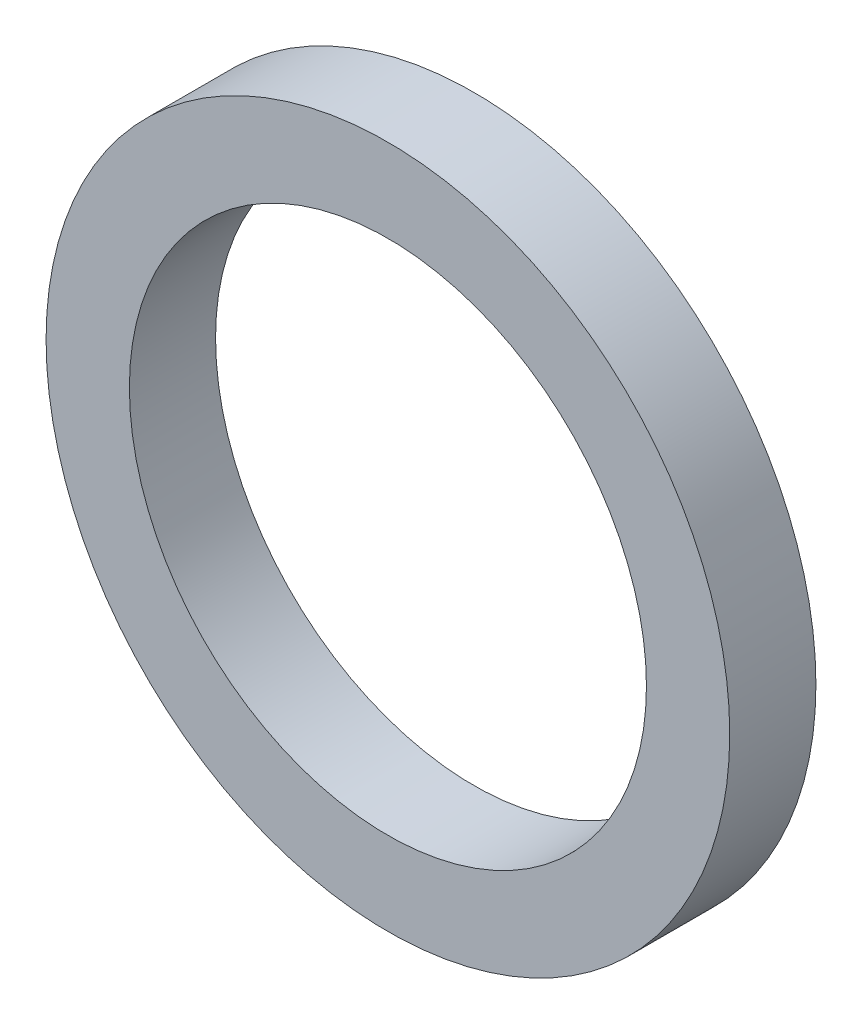
ISO-10303-21;
HEADER;
FILE_DESCRIPTION(('STEP AP214'),'2;1');
FILE_NAME('part.step','',(''),(''),'','','');
FILE_SCHEMA(('AUTOMOTIVE_DESIGN { 1 0 10303 214 1 1 1 1 }'));
ENDSEC;
DATA;
#1=APPLICATION_CONTEXT('core data for automotive mechanical design processes');
#2=APPLICATION_PROTOCOL_DEFINITION('international standard','automotive_design',2000,#1);
#3=PRODUCT_CONTEXT('',#1,'mechanical');
#4=PRODUCT('Part','Part','',(#3));
#5=PRODUCT_RELATED_PRODUCT_CATEGORY('part','',(#4));
#6=PRODUCT_DEFINITION_FORMATION('','',#4);
#7=PRODUCT_DEFINITION_CONTEXT('part definition',#1,'design');
#8=PRODUCT_DEFINITION('design','',#6,#7);
#9=PRODUCT_DEFINITION_SHAPE('','',#8);
#10=(LENGTH_UNIT() NAMED_UNIT(*) SI_UNIT(.MILLI.,.METRE.));
#11=(NAMED_UNIT(*) PLANE_ANGLE_UNIT() SI_UNIT($,.RADIAN.));
#12=(NAMED_UNIT(*) SI_UNIT($,.STERADIAN.) SOLID_ANGLE_UNIT());
#13=UNCERTAINTY_MEASURE_WITH_UNIT(LENGTH_MEASURE(1.E-05),#10,'distance_accuracy_value','');
#14=(GEOMETRIC_REPRESENTATION_CONTEXT(3) GLOBAL_UNCERTAINTY_ASSIGNED_CONTEXT((#13)) GLOBAL_UNIT_ASSIGNED_CONTEXT((#10,
#11,#12)) REPRESENTATION_CONTEXT('',''));
#15=CARTESIAN_POINT('',(0.,0.,0.));
#16=DIRECTION('',(0.,0.,1.));
#17=DIRECTION('',(1.,0.,0.));
#18=AXIS2_PLACEMENT_3D('',#15,#16,#17);
#19=CARTESIAN_POINT('',(0.,9.87,1.));
#20=DIRECTION('',(0.,0.,1.));
#21=DIRECTION('',(1.,0.,0.));
#22=AXIS2_PLACEMENT_3D('',#19,#20,#21);
#23=PLANE('',#22);
#24=CARTESIAN_POINT('',(0.,0.,1.));
#25=DIRECTION('',(0.,0.,-1.));
#26=DIRECTION('',(-1.,0.,0.));
#27=AXIS2_PLACEMENT_3D('',#24,#25,#26);
#28=CIRCLE('',#27,11.03);
#29=CARTESIAN_POINT('',(-11.03,0.,1.));
#30=VERTEX_POINT('',#29);
#31=EDGE_CURVE('E18',#30,#30,#28,.T.);
#32=ORIENTED_EDGE('',*,*,#31,.T.);
#33=EDGE_LOOP('',(#32));
#34=FACE_BOUND('',#33,.T.);
#35=CARTESIAN_POINT('',(0.,0.,1.));
#36=DIRECTION('',(0.,0.,-1.));
#37=DIRECTION('',(-1.,0.,0.));
#38=AXIS2_PLACEMENT_3D('',#35,#36,#37);
#39=CIRCLE('',#38,9.87);
#40=CARTESIAN_POINT('',(-9.87,0.,1.));
#41=VERTEX_POINT('',#40);
#42=EDGE_CURVE('E40',#41,#41,#39,.T.);
#43=ORIENTED_EDGE('',*,*,#42,.F.);
#44=EDGE_LOOP('',(#43));
#45=FACE_BOUND('',#44,.T.);
#46=ADVANCED_FACE('F15',(#34,#45),#23,.F.);
#47=CARTESIAN_POINT('',(0.,0.,0.));
#48=DIRECTION('',(0.,0.,-1.));
#49=DIRECTION('',(-1.,0.,0.));
#50=AXIS2_PLACEMENT_3D('',#47,#48,#49);
#51=CYLINDRICAL_SURFACE('',#50,11.03);
#52=ORIENTED_EDGE('',*,*,#31,.F.);
#53=EDGE_LOOP('',(#52));
#54=FACE_BOUND('',#53,.T.);
#55=CARTESIAN_POINT('',(0.,0.,0.));
#56=DIRECTION('',(0.,0.,-1.));
#57=DIRECTION('',(-1.,0.,0.));
#58=AXIS2_PLACEMENT_3D('',#55,#56,#57);
#59=CIRCLE('',#58,11.03);
#60=CARTESIAN_POINT('',(-11.03,0.,0.));
#61=VERTEX_POINT('',#60);
#62=EDGE_CURVE('E38',#61,#61,#59,.T.);
#63=ORIENTED_EDGE('',*,*,#62,.T.);
#64=EDGE_LOOP('',(#63));
#65=FACE_BOUND('',#64,.T.);
#66=ADVANCED_FACE('F49',(#54,#65),#51,.F.);
#67=CARTESIAN_POINT('',(0.,0.,0.));
#68=DIRECTION('',(0.,0.,-1.));
#69=DIRECTION('',(-1.,0.,0.));
#70=AXIS2_PLACEMENT_3D('',#67,#68,#69);
#71=CYLINDRICAL_SURFACE('',#70,9.87);
#72=CARTESIAN_POINT('',(0.,0.,0.));
#73=DIRECTION('',(0.,0.,-1.));
#74=DIRECTION('',(-1.,0.,0.));
#75=AXIS2_PLACEMENT_3D('',#72,#73,#74);
#76=CIRCLE('',#75,9.87);
#77=CARTESIAN_POINT('',(-9.87,0.,0.));
#78=VERTEX_POINT('',#77);
#79=EDGE_CURVE('E35',#78,#78,#76,.F.);
#80=ORIENTED_EDGE('',*,*,#79,.T.);
#81=EDGE_LOOP('',(#80));
#82=FACE_BOUND('',#81,.T.);
#83=ORIENTED_EDGE('',*,*,#42,.T.);
#84=EDGE_LOOP('',(#83));
#85=FACE_BOUND('',#84,.T.);
#86=ADVANCED_FACE('F52',(#82,#85),#71,.T.);
#87=CARTESIAN_POINT('',(0.,0.,0.));
#88=DIRECTION('',(0.,0.,1.));
#89=DIRECTION('',(1.,0.,0.));
#90=AXIS2_PLACEMENT_3D('',#87,#88,#89);
#91=PLANE('',#90);
#92=CARTESIAN_POINT('',(0.,0.,0.));
#93=DIRECTION('',(0.,0.,-1.));
#94=DIRECTION('',(-1.,0.,0.));
#95=AXIS2_PLACEMENT_3D('',#92,#93,#94);
#96=CIRCLE('',#95,11.9);
#97=CARTESIAN_POINT('',(-11.9,0.,0.));
#98=VERTEX_POINT('',#97);
#99=EDGE_CURVE('E32',#98,#98,#96,.F.);
#100=ORIENTED_EDGE('',*,*,#99,.F.);
#101=EDGE_LOOP('',(#100));
#102=FACE_BOUND('',#101,.T.);
#103=ORIENTED_EDGE('',*,*,#62,.F.);
#104=EDGE_LOOP('',(#103));
#105=FACE_BOUND('',#104,.T.);
#106=ADVANCED_FACE('F55',(#102,#105),#91,.F.);
#107=CARTESIAN_POINT('',(0.,0.,0.));
#108=DIRECTION('',(0.,0.,1.));
#109=DIRECTION('',(1.,0.,0.));
#110=AXIS2_PLACEMENT_3D('',#107,#108,#109);
#111=PLANE('',#110);
#112=CARTESIAN_POINT('',(0.,0.,0.));
#113=DIRECTION('',(0.,0.,-1.));
#114=DIRECTION('',(-1.,0.,0.));
#115=AXIS2_PLACEMENT_3D('',#112,#113,#114);
#116=CIRCLE('',#115,9.);
#117=CARTESIAN_POINT('',(-9.,0.,0.));
#118=VERTEX_POINT('',#117);
#119=EDGE_CURVE('E27',#118,#118,#116,.F.);
#120=ORIENTED_EDGE('',*,*,#119,.T.);
#121=EDGE_LOOP('',(#120));
#122=FACE_BOUND('',#121,.T.);
#123=ORIENTED_EDGE('',*,*,#79,.F.);
#124=EDGE_LOOP('',(#123));
#125=FACE_BOUND('',#124,.T.);
#126=ADVANCED_FACE('F57',(#122,#125),#111,.F.);
#127=CARTESIAN_POINT('',(0.,0.,3.));
#128=DIRECTION('',(0.,0.,-1.));
#129=DIRECTION('',(-1.,0.,0.));
#130=AXIS2_PLACEMENT_3D('',#127,#128,#129);
#131=CYLINDRICAL_SURFACE('',#130,11.9);
#132=ORIENTED_EDGE('',*,*,#99,.T.);
#133=EDGE_LOOP('',(#132));
#134=FACE_BOUND('',#133,.T.);
#135=CARTESIAN_POINT('',(0.,0.,3.));
#136=DIRECTION('',(0.,0.,-1.));
#137=DIRECTION('',(-1.,0.,0.));
#138=AXIS2_PLACEMENT_3D('',#135,#136,#137);
#139=CIRCLE('',#138,11.9);
#140=CARTESIAN_POINT('',(-11.9,0.,3.));
#141=VERTEX_POINT('',#140);
#142=EDGE_CURVE('E22',#141,#141,#139,.F.);
#143=ORIENTED_EDGE('',*,*,#142,.F.);
#144=EDGE_LOOP('',(#143));
#145=FACE_BOUND('',#144,.T.);
#146=ADVANCED_FACE('F65',(#134,#145),#131,.T.);
#147=CARTESIAN_POINT('',(0.,0.,3.));
#148=DIRECTION('',(0.,0.,-1.));
#149=DIRECTION('',(-1.,0.,0.));
#150=AXIS2_PLACEMENT_3D('',#147,#148,#149);
#151=CYLINDRICAL_SURFACE('',#150,9.);
#152=CARTESIAN_POINT('',(0.,0.,3.));
#153=DIRECTION('',(0.,0.,-1.));
#154=DIRECTION('',(-1.,0.,0.));
#155=AXIS2_PLACEMENT_3D('',#152,#153,#154);
#156=CIRCLE('',#155,9.);
#157=CARTESIAN_POINT('',(-9.,0.,3.));
#158=VERTEX_POINT('',#157);
#159=EDGE_CURVE('E10',#158,#158,#156,.T.);
#160=ORIENTED_EDGE('',*,*,#159,.F.);
#161=EDGE_LOOP('',(#160));
#162=FACE_BOUND('',#161,.T.);
#163=ORIENTED_EDGE('',*,*,#119,.F.);
#164=EDGE_LOOP('',(#163));
#165=FACE_BOUND('',#164,.T.);
#166=ADVANCED_FACE('F73',(#162,#165),#151,.F.);
#167=CARTESIAN_POINT('',(0.,0.,3.));
#168=DIRECTION('',(0.,0.,1.));
#169=DIRECTION('',(1.,0.,0.));
#170=AXIS2_PLACEMENT_3D('',#167,#168,#169);
#171=PLANE('',#170);
#172=ORIENTED_EDGE('',*,*,#159,.T.);
#173=EDGE_LOOP('',(#172));
#174=FACE_BOUND('',#173,.T.);
#175=ORIENTED_EDGE('',*,*,#142,.T.);
#176=EDGE_LOOP('',(#175));
#177=FACE_BOUND('',#176,.T.);
#178=ADVANCED_FACE('F71',(#174,#177),#171,.T.);
#179=CLOSED_SHELL('',(#46,#66,#86,#106,#126,#146,#166,#178));
#180=MANIFOLD_SOLID_BREP('B1',#179);
#181=ADVANCED_BREP_SHAPE_REPRESENTATION('',(#18,#180),#14);
#182=SHAPE_DEFINITION_REPRESENTATION(#9,#181);
ENDSEC;
END-ISO-10303-21;
